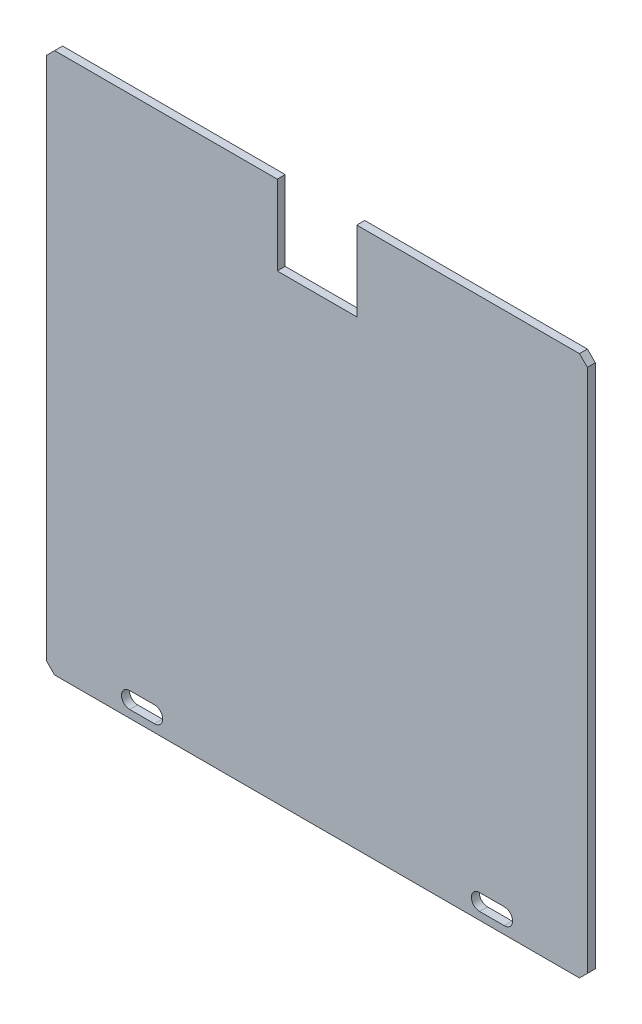
ISO-10303-21;
HEADER;
FILE_DESCRIPTION(('STEP AP214'),'2;1');
FILE_NAME('part.step','',(''),(''),'','','');
FILE_SCHEMA(('AUTOMOTIVE_DESIGN { 1 0 10303 214 1 1 1 1 }'));
ENDSEC;
DATA;
#1=APPLICATION_CONTEXT('core data for automotive mechanical design processes');
#2=APPLICATION_PROTOCOL_DEFINITION('international standard','automotive_design',2000,#1);
#3=PRODUCT_CONTEXT('',#1,'mechanical');
#4=PRODUCT('Part','Part','',(#3));
#5=PRODUCT_RELATED_PRODUCT_CATEGORY('part','',(#4));
#6=PRODUCT_DEFINITION_FORMATION('','',#4);
#7=PRODUCT_DEFINITION_CONTEXT('part definition',#1,'design');
#8=PRODUCT_DEFINITION('design','',#6,#7);
#9=PRODUCT_DEFINITION_SHAPE('','',#8);
#10=(LENGTH_UNIT() NAMED_UNIT(*) SI_UNIT(.MILLI.,.METRE.));
#11=(NAMED_UNIT(*) PLANE_ANGLE_UNIT() SI_UNIT($,.RADIAN.));
#12=(NAMED_UNIT(*) SI_UNIT($,.STERADIAN.) SOLID_ANGLE_UNIT());
#13=UNCERTAINTY_MEASURE_WITH_UNIT(LENGTH_MEASURE(1.E-05),#10,'distance_accuracy_value','');
#14=(GEOMETRIC_REPRESENTATION_CONTEXT(3) GLOBAL_UNCERTAINTY_ASSIGNED_CONTEXT((#13)) GLOBAL_UNIT_ASSIGNED_CONTEXT((#10,
#11,#12)) REPRESENTATION_CONTEXT('',''));
#15=CARTESIAN_POINT('',(0.,0.,0.));
#16=DIRECTION('',(0.,0.,1.));
#17=DIRECTION('',(1.,0.,0.));
#18=AXIS2_PLACEMENT_3D('',#15,#16,#17);
#19=CARTESIAN_POINT('',(-170.,170.,5.));
#20=DIRECTION('',(0.,-1.,0.));
#21=DIRECTION('',(0.,0.,-1.));
#22=AXIS2_PLACEMENT_3D('',#19,#20,#21);
#23=PLANE('',#22);
#24=DIRECTION('',(-1.,0.,0.));
#25=VECTOR('',#24,1.);
#26=CARTESIAN_POINT('',(-170.,170.,0.));
#27=LINE('',#26,#25);
#28=CARTESIAN_POINT('',(165.,170.,0.));
#29=VERTEX_POINT('',#28);
#30=CARTESIAN_POINT('',(25.,170.,0.));
#31=VERTEX_POINT('',#30);
#32=EDGE_CURVE('E188',#29,#31,#27,.T.);
#33=ORIENTED_EDGE('',*,*,#32,.T.);
#34=DIRECTION('',(0.,0.,1.));
#35=VECTOR('',#34,1.);
#36=CARTESIAN_POINT('',(25.,170.,0.));
#37=LINE('',#36,#35);
#38=CARTESIAN_POINT('',(25.,170.,5.));
#39=VERTEX_POINT('',#38);
#40=EDGE_CURVE('E170',#31,#39,#37,.T.);
#41=ORIENTED_EDGE('',*,*,#40,.T.);
#42=DIRECTION('',(-1.,0.,0.));
#43=VECTOR('',#42,1.);
#44=CARTESIAN_POINT('',(-170.,170.,5.));
#45=LINE('',#44,#43);
#46=CARTESIAN_POINT('',(165.,170.,5.));
#47=VERTEX_POINT('',#46);
#48=EDGE_CURVE('E264',#47,#39,#45,.T.);
#49=ORIENTED_EDGE('',*,*,#48,.F.);
#50=DIRECTION('',(0.,0.,-1.));
#51=VECTOR('',#50,1.);
#52=CARTESIAN_POINT('',(165.,170.,5.));
#53=LINE('',#52,#51);
#54=EDGE_CURVE('E194',#47,#29,#53,.T.);
#55=ORIENTED_EDGE('',*,*,#54,.T.);
#56=EDGE_LOOP('',(#33,#41,#49,#55));
#57=FACE_BOUND('',#56,.T.);
#58=ADVANCED_FACE('F32',(#57),#23,.F.);
#59=CARTESIAN_POINT('',(0.,0.,5.));
#60=DIRECTION('',(0.,0.,-1.));
#61=DIRECTION('',(-1.,0.,0.));
#62=AXIS2_PLACEMENT_3D('',#59,#60,#61);
#63=PLANE('',#62);
#64=ORIENTED_EDGE('',*,*,#48,.T.);
#65=DIRECTION('',(0.,1.,0.));
#66=VECTOR('',#65,1.);
#67=CARTESIAN_POINT('',(25.,120.,5.));
#68=LINE('',#67,#66);
#69=CARTESIAN_POINT('',(25.,120.,5.));
#70=VERTEX_POINT('',#69);
#71=EDGE_CURVE('E176',#70,#39,#68,.T.);
#72=ORIENTED_EDGE('',*,*,#71,.F.);
#73=DIRECTION('',(1.,0.,0.));
#74=VECTOR('',#73,1.);
#75=CARTESIAN_POINT('',(-25.,120.,5.));
#76=LINE('',#75,#74);
#77=CARTESIAN_POINT('',(-25.,120.,5.));
#78=VERTEX_POINT('',#77);
#79=EDGE_CURVE('E190',#78,#70,#76,.T.);
#80=ORIENTED_EDGE('',*,*,#79,.F.);
#81=DIRECTION('',(0.,-1.,0.));
#82=VECTOR('',#81,1.);
#83=CARTESIAN_POINT('',(-25.,120.,5.));
#84=LINE('',#83,#82);
#85=CARTESIAN_POINT('',(-25.,170.,5.));
#86=VERTEX_POINT('',#85);
#87=EDGE_CURVE('E337',#86,#78,#84,.T.);
#88=ORIENTED_EDGE('',*,*,#87,.F.);
#89=CARTESIAN_POINT('',(-165.,170.,5.));
#90=VERTEX_POINT('',#89);
#91=EDGE_CURVE('E268',#86,#90,#45,.T.);
#92=ORIENTED_EDGE('',*,*,#91,.T.);
#93=DIRECTION('',(0.707106781186551,0.707106781186544,0.));
#94=VECTOR('',#93,1.);
#95=CARTESIAN_POINT('',(-170.,165.,5.));
#96=LINE('',#95,#94);
#97=CARTESIAN_POINT('',(-170.,165.,5.));
#98=VERTEX_POINT('',#97);
#99=EDGE_CURVE('E227',#90,#98,#96,.F.);
#100=ORIENTED_EDGE('',*,*,#99,.T.);
#101=DIRECTION('',(0.,-1.,0.));
#102=VECTOR('',#101,1.);
#103=CARTESIAN_POINT('',(-170.,-170.,5.));
#104=LINE('',#103,#102);
#105=CARTESIAN_POINT('',(-170.,-165.,5.));
#106=VERTEX_POINT('',#105);
#107=EDGE_CURVE('E247',#98,#106,#104,.T.);
#108=ORIENTED_EDGE('',*,*,#107,.T.);
#109=DIRECTION('',(-0.707106781186544,0.707106781186551,0.));
#110=VECTOR('',#109,1.);
#111=CARTESIAN_POINT('',(-165.,-170.,5.));
#112=LINE('',#111,#110);
#113=CARTESIAN_POINT('',(-165.,-170.,5.));
#114=VERTEX_POINT('',#113);
#115=EDGE_CURVE('E229',#106,#114,#112,.F.);
#116=ORIENTED_EDGE('',*,*,#115,.T.);
#117=DIRECTION('',(1.,0.,0.));
#118=VECTOR('',#117,1.);
#119=CARTESIAN_POINT('',(-170.,-170.,5.));
#120=LINE('',#119,#118);
#121=CARTESIAN_POINT('',(165.,-170.,5.));
#122=VERTEX_POINT('',#121);
#123=EDGE_CURVE('E211',#114,#122,#120,.T.);
#124=ORIENTED_EDGE('',*,*,#123,.T.);
#125=DIRECTION('',(-0.707106781186551,-0.707106781186544,0.));
#126=VECTOR('',#125,1.);
#127=CARTESIAN_POINT('',(170.,-165.,5.));
#128=LINE('',#127,#126);
#129=CARTESIAN_POINT('',(170.,-165.,5.));
#130=VERTEX_POINT('',#129);
#131=EDGE_CURVE('E231',#122,#130,#128,.F.);
#132=ORIENTED_EDGE('',*,*,#131,.T.);
#133=DIRECTION('',(0.,1.,0.));
#134=VECTOR('',#133,1.);
#135=CARTESIAN_POINT('',(170.,-170.,5.));
#136=LINE('',#135,#134);
#137=CARTESIAN_POINT('',(170.,165.,5.));
#138=VERTEX_POINT('',#137);
#139=EDGE_CURVE('E207',#130,#138,#136,.T.);
#140=ORIENTED_EDGE('',*,*,#139,.T.);
#141=DIRECTION('',(0.707106781186544,-0.707106781186551,0.));
#142=VECTOR('',#141,1.);
#143=CARTESIAN_POINT('',(165.,170.,5.));
#144=LINE('',#143,#142);
#145=EDGE_CURVE('E233',#138,#47,#144,.F.);
#146=ORIENTED_EDGE('',*,*,#145,.T.);
#147=EDGE_LOOP('',(#64,#72,#80,#88,#92,#100,#108,#116,#124,#132,#140,#146));
#148=FACE_BOUND('',#147,.T.);
#149=DIRECTION('',(1.,0.,0.));
#150=VECTOR('',#149,1.);
#151=CARTESIAN_POINT('',(-117.8,-165.15,5.));
#152=LINE('',#151,#150);
#153=CARTESIAN_POINT('',(-117.8,-165.15,5.));
#154=VERTEX_POINT('',#153);
#155=CARTESIAN_POINT('',(-102.2,-165.15,5.));
#156=VERTEX_POINT('',#155);
#157=EDGE_CURVE('E288',#154,#156,#152,.T.);
#158=ORIENTED_EDGE('',*,*,#157,.F.);
#159=CARTESIAN_POINT('',(-117.8,-160.,5.));
#160=DIRECTION('',(0.,0.,1.));
#161=DIRECTION('',(1.,0.,0.));
#162=AXIS2_PLACEMENT_3D('',#159,#160,#161);
#163=CIRCLE('',#162,5.15000000000002);
#164=CARTESIAN_POINT('',(-117.8,-154.85,5.));
#165=VERTEX_POINT('',#164);
#166=EDGE_CURVE('E291',#165,#154,#163,.T.);
#167=ORIENTED_EDGE('',*,*,#166,.F.);
#168=DIRECTION('',(-1.,0.,0.));
#169=VECTOR('',#168,1.);
#170=CARTESIAN_POINT('',(-117.8,-154.85,5.));
#171=LINE('',#170,#169);
#172=CARTESIAN_POINT('',(-102.2,-154.85,5.));
#173=VERTEX_POINT('',#172);
#174=EDGE_CURVE('E281',#173,#165,#171,.T.);
#175=ORIENTED_EDGE('',*,*,#174,.F.);
#176=CARTESIAN_POINT('',(-102.2,-160.,5.));
#177=DIRECTION('',(0.,0.,1.));
#178=DIRECTION('',(1.,0.,0.));
#179=AXIS2_PLACEMENT_3D('',#176,#177,#178);
#180=CIRCLE('',#179,5.15000000000002);
#181=EDGE_CURVE('E285',#156,#173,#180,.T.);
#182=ORIENTED_EDGE('',*,*,#181,.F.);
#183=EDGE_LOOP('',(#158,#167,#175,#182));
#184=FACE_BOUND('',#183,.T.);
#185=CARTESIAN_POINT('',(117.8,-160.,5.));
#186=DIRECTION('',(0.,0.,-1.));
#187=DIRECTION('',(-1.,0.,0.));
#188=AXIS2_PLACEMENT_3D('',#185,#186,#187);
#189=CIRCLE('',#188,5.15000000000002);
#190=CARTESIAN_POINT('',(117.8,-154.85,5.));
#191=VERTEX_POINT('',#190);
#192=CARTESIAN_POINT('',(117.8,-165.15,5.));
#193=VERTEX_POINT('',#192);
#194=EDGE_CURVE('E55',#191,#193,#189,.T.);
#195=ORIENTED_EDGE('',*,*,#194,.T.);
#196=DIRECTION('',(-1.,0.,0.));
#197=VECTOR('',#196,1.);
#198=CARTESIAN_POINT('',(117.8,-165.15,5.));
#199=LINE('',#198,#197);
#200=CARTESIAN_POINT('',(102.2,-165.15,5.));
#201=VERTEX_POINT('',#200);
#202=EDGE_CURVE('E312',#193,#201,#199,.T.);
#203=ORIENTED_EDGE('',*,*,#202,.T.);
#204=CARTESIAN_POINT('',(102.2,-160.,5.));
#205=DIRECTION('',(0.,0.,-1.));
#206=DIRECTION('',(-1.,0.,0.));
#207=AXIS2_PLACEMENT_3D('',#204,#205,#206);
#208=CIRCLE('',#207,5.15000000000002);
#209=CARTESIAN_POINT('',(102.2,-154.85,5.));
#210=VERTEX_POINT('',#209);
#211=EDGE_CURVE('E316',#201,#210,#208,.T.);
#212=ORIENTED_EDGE('',*,*,#211,.T.);
#213=DIRECTION('',(1.,0.,0.));
#214=VECTOR('',#213,1.);
#215=CARTESIAN_POINT('',(117.8,-154.85,5.));
#216=LINE('',#215,#214);
#217=EDGE_CURVE('E319',#210,#191,#216,.T.);
#218=ORIENTED_EDGE('',*,*,#217,.T.);
#219=EDGE_LOOP('',(#195,#203,#212,#218));
#220=FACE_BOUND('',#219,.T.);
#221=ADVANCED_FACE('F348',(#148,#184,#220),#63,.F.);
#222=CARTESIAN_POINT('',(0.,0.,0.));
#223=DIRECTION('',(0.,0.,-1.));
#224=DIRECTION('',(-1.,0.,0.));
#225=AXIS2_PLACEMENT_3D('',#222,#223,#224);
#226=PLANE('',#225);
#227=DIRECTION('',(0.,1.,0.));
#228=VECTOR('',#227,1.);
#229=CARTESIAN_POINT('',(25.,120.,0.));
#230=LINE('',#229,#228);
#231=CARTESIAN_POINT('',(25.,120.,0.));
#232=VERTEX_POINT('',#231);
#233=EDGE_CURVE('E173',#232,#31,#230,.T.);
#234=ORIENTED_EDGE('',*,*,#233,.T.);
#235=ORIENTED_EDGE('',*,*,#32,.F.);
#236=DIRECTION('',(-0.707106781186544,0.707106781186551,0.));
#237=VECTOR('',#236,1.);
#238=CARTESIAN_POINT('',(167.500000000001,167.499999999999,0.));
#239=LINE('',#238,#237);
#240=CARTESIAN_POINT('',(170.,165.,0.));
#241=VERTEX_POINT('',#240);
#242=EDGE_CURVE('E220',#29,#241,#239,.F.);
#243=ORIENTED_EDGE('',*,*,#242,.T.);
#244=DIRECTION('',(0.,1.,0.));
#245=VECTOR('',#244,1.);
#246=CARTESIAN_POINT('',(170.,-170.,0.));
#247=LINE('',#246,#245);
#248=CARTESIAN_POINT('',(170.,-165.,0.));
#249=VERTEX_POINT('',#248);
#250=EDGE_CURVE('E201',#249,#241,#247,.T.);
#251=ORIENTED_EDGE('',*,*,#250,.F.);
#252=DIRECTION('',(0.707106781186551,0.707106781186544,0.));
#253=VECTOR('',#252,1.);
#254=CARTESIAN_POINT('',(167.499999999999,-167.500000000001,0.));
#255=LINE('',#254,#253);
#256=CARTESIAN_POINT('',(165.,-170.,0.));
#257=VERTEX_POINT('',#256);
#258=EDGE_CURVE('E218',#249,#257,#255,.F.);
#259=ORIENTED_EDGE('',*,*,#258,.T.);
#260=DIRECTION('',(1.,0.,0.));
#261=VECTOR('',#260,1.);
#262=CARTESIAN_POINT('',(-170.,-170.,0.));
#263=LINE('',#262,#261);
#264=CARTESIAN_POINT('',(-165.,-170.,0.));
#265=VERTEX_POINT('',#264);
#266=EDGE_CURVE('E199',#265,#257,#263,.T.);
#267=ORIENTED_EDGE('',*,*,#266,.F.);
#268=DIRECTION('',(0.707106781186544,-0.707106781186551,0.));
#269=VECTOR('',#268,1.);
#270=CARTESIAN_POINT('',(-167.500000000001,-167.499999999999,0.));
#271=LINE('',#270,#269);
#272=CARTESIAN_POINT('',(-170.,-165.,0.));
#273=VERTEX_POINT('',#272);
#274=EDGE_CURVE('E216',#265,#273,#271,.F.);
#275=ORIENTED_EDGE('',*,*,#274,.T.);
#276=DIRECTION('',(0.,-1.,0.));
#277=VECTOR('',#276,1.);
#278=CARTESIAN_POINT('',(-170.,-170.,0.));
#279=LINE('',#278,#277);
#280=CARTESIAN_POINT('',(-170.,165.,0.));
#281=VERTEX_POINT('',#280);
#282=EDGE_CURVE('E195',#281,#273,#279,.T.);
#283=ORIENTED_EDGE('',*,*,#282,.F.);
#284=DIRECTION('',(-0.707106781186551,-0.707106781186544,0.));
#285=VECTOR('',#284,1.);
#286=CARTESIAN_POINT('',(-167.499999999999,167.500000000001,0.));
#287=LINE('',#286,#285);
#288=CARTESIAN_POINT('',(-165.,170.,0.));
#289=VERTEX_POINT('',#288);
#290=EDGE_CURVE('E213',#281,#289,#287,.F.);
#291=ORIENTED_EDGE('',*,*,#290,.T.);
#292=CARTESIAN_POINT('',(-25.,170.,0.));
#293=VERTEX_POINT('',#292);
#294=EDGE_CURVE('E196',#293,#289,#27,.T.);
#295=ORIENTED_EDGE('',*,*,#294,.F.);
#296=DIRECTION('',(0.,-1.,0.));
#297=VECTOR('',#296,1.);
#298=CARTESIAN_POINT('',(-25.,120.,0.));
#299=LINE('',#298,#297);
#300=CARTESIAN_POINT('',(-25.,120.,0.));
#301=VERTEX_POINT('',#300);
#302=EDGE_CURVE('E47',#293,#301,#299,.T.);
#303=ORIENTED_EDGE('',*,*,#302,.T.);
#304=DIRECTION('',(1.,0.,0.));
#305=VECTOR('',#304,1.);
#306=CARTESIAN_POINT('',(-25.,120.,0.));
#307=LINE('',#306,#305);
#308=EDGE_CURVE('E182',#301,#232,#307,.T.);
#309=ORIENTED_EDGE('',*,*,#308,.T.);
#310=EDGE_LOOP('',(#234,#235,#243,#251,#259,#267,#275,#283,#291,#295,#303,#309));
#311=FACE_BOUND('',#310,.T.);
#312=CARTESIAN_POINT('',(-117.8,-160.,0.));
#313=DIRECTION('',(0.,0.,1.));
#314=DIRECTION('',(1.,0.,0.));
#315=AXIS2_PLACEMENT_3D('',#312,#313,#314);
#316=CIRCLE('',#315,5.15000000000002);
#317=CARTESIAN_POINT('',(-117.8,-154.85,0.));
#318=VERTEX_POINT('',#317);
#319=CARTESIAN_POINT('',(-117.8,-165.15,0.));
#320=VERTEX_POINT('',#319);
#321=EDGE_CURVE('E284',#318,#320,#316,.T.);
#322=ORIENTED_EDGE('',*,*,#321,.T.);
#323=DIRECTION('',(1.,0.,0.));
#324=VECTOR('',#323,1.);
#325=CARTESIAN_POINT('',(-117.8,-165.15,0.));
#326=LINE('',#325,#324);
#327=CARTESIAN_POINT('',(-102.2,-165.15,0.));
#328=VERTEX_POINT('',#327);
#329=EDGE_CURVE('E299',#320,#328,#326,.T.);
#330=ORIENTED_EDGE('',*,*,#329,.T.);
#331=CARTESIAN_POINT('',(-102.2,-160.,0.));
#332=DIRECTION('',(0.,0.,1.));
#333=DIRECTION('',(1.,0.,0.));
#334=AXIS2_PLACEMENT_3D('',#331,#332,#333);
#335=CIRCLE('',#334,5.15000000000002);
#336=CARTESIAN_POINT('',(-102.2,-154.85,0.));
#337=VERTEX_POINT('',#336);
#338=EDGE_CURVE('E296',#328,#337,#335,.T.);
#339=ORIENTED_EDGE('',*,*,#338,.T.);
#340=DIRECTION('',(-1.,0.,0.));
#341=VECTOR('',#340,1.);
#342=CARTESIAN_POINT('',(-117.8,-154.85,0.));
#343=LINE('',#342,#341);
#344=EDGE_CURVE('E275',#337,#318,#343,.T.);
#345=ORIENTED_EDGE('',*,*,#344,.T.);
#346=EDGE_LOOP('',(#322,#330,#339,#345));
#347=FACE_BOUND('',#346,.T.);
#348=DIRECTION('',(-1.,0.,0.));
#349=VECTOR('',#348,1.);
#350=CARTESIAN_POINT('',(117.8,-165.15,0.));
#351=LINE('',#350,#349);
#352=CARTESIAN_POINT('',(117.8,-165.15,0.));
#353=VERTEX_POINT('',#352);
#354=CARTESIAN_POINT('',(102.2,-165.15,0.));
#355=VERTEX_POINT('',#354);
#356=EDGE_CURVE('E307',#353,#355,#351,.T.);
#357=ORIENTED_EDGE('',*,*,#356,.F.);
#358=CARTESIAN_POINT('',(117.8,-160.,0.));
#359=DIRECTION('',(0.,0.,-1.));
#360=DIRECTION('',(-1.,0.,0.));
#361=AXIS2_PLACEMENT_3D('',#358,#359,#360);
#362=CIRCLE('',#361,5.15000000000002);
#363=CARTESIAN_POINT('',(117.8,-154.85,0.));
#364=VERTEX_POINT('',#363);
#365=EDGE_CURVE('E315',#364,#353,#362,.T.);
#366=ORIENTED_EDGE('',*,*,#365,.F.);
#367=DIRECTION('',(1.,0.,0.));
#368=VECTOR('',#367,1.);
#369=CARTESIAN_POINT('',(117.8,-154.85,0.));
#370=LINE('',#369,#368);
#371=CARTESIAN_POINT('',(102.2,-154.85,0.));
#372=VERTEX_POINT('',#371);
#373=EDGE_CURVE('E328',#372,#364,#370,.T.);
#374=ORIENTED_EDGE('',*,*,#373,.F.);
#375=CARTESIAN_POINT('',(102.2,-160.,0.));
#376=DIRECTION('',(0.,0.,-1.));
#377=DIRECTION('',(-1.,0.,0.));
#378=AXIS2_PLACEMENT_3D('',#375,#376,#377);
#379=CIRCLE('',#378,5.15000000000002);
#380=EDGE_CURVE('E325',#355,#372,#379,.T.);
#381=ORIENTED_EDGE('',*,*,#380,.F.);
#382=EDGE_LOOP('',(#357,#366,#374,#381));
#383=FACE_BOUND('',#382,.T.);
#384=ADVANCED_FACE('F186',(#311,#347,#383),#226,.T.);
#385=CARTESIAN_POINT('',(170.,-170.,5.));
#386=DIRECTION('',(-1.,0.,0.));
#387=DIRECTION('',(0.,0.,1.));
#388=AXIS2_PLACEMENT_3D('',#385,#386,#387);
#389=PLANE('',#388);
#390=ORIENTED_EDGE('',*,*,#250,.T.);
#391=DIRECTION('',(0.,0.,1.));
#392=VECTOR('',#391,1.);
#393=CARTESIAN_POINT('',(170.,165.,5.));
#394=LINE('',#393,#392);
#395=EDGE_CURVE('E225',#241,#138,#394,.T.);
#396=ORIENTED_EDGE('',*,*,#395,.T.);
#397=ORIENTED_EDGE('',*,*,#139,.F.);
#398=DIRECTION('',(0.,0.,-1.));
#399=VECTOR('',#398,1.);
#400=CARTESIAN_POINT('',(170.,-165.,5.));
#401=LINE('',#400,#399);
#402=EDGE_CURVE('E222',#130,#249,#401,.T.);
#403=ORIENTED_EDGE('',*,*,#402,.T.);
#404=EDGE_LOOP('',(#390,#396,#397,#403));
#405=FACE_BOUND('',#404,.T.);
#406=ADVANCED_FACE('F370',(#405),#389,.F.);
#407=ORIENTED_EDGE('',*,*,#91,.F.);
#408=DIRECTION('',(0.,0.,1.));
#409=VECTOR('',#408,1.);
#410=CARTESIAN_POINT('',(-25.,170.,0.));
#411=LINE('',#410,#409);
#412=EDGE_CURVE('E181',#293,#86,#411,.T.);
#413=ORIENTED_EDGE('',*,*,#412,.F.);
#414=ORIENTED_EDGE('',*,*,#294,.T.);
#415=DIRECTION('',(0.,0.,1.));
#416=VECTOR('',#415,1.);
#417=CARTESIAN_POINT('',(-165.,170.,5.));
#418=LINE('',#417,#416);
#419=EDGE_CURVE('E208',#289,#90,#418,.T.);
#420=ORIENTED_EDGE('',*,*,#419,.T.);
#421=EDGE_LOOP('',(#407,#413,#414,#420));
#422=FACE_BOUND('',#421,.T.);
#423=ADVANCED_FACE('F344',(#422),#23,.F.);
#424=CARTESIAN_POINT('',(-170.,-170.,5.));
#425=DIRECTION('',(1.,0.,0.));
#426=DIRECTION('',(0.,0.,-1.));
#427=AXIS2_PLACEMENT_3D('',#424,#425,#426);
#428=PLANE('',#427);
#429=ORIENTED_EDGE('',*,*,#282,.T.);
#430=DIRECTION('',(0.,0.,1.));
#431=VECTOR('',#430,1.);
#432=CARTESIAN_POINT('',(-170.,-165.,5.));
#433=LINE('',#432,#431);
#434=EDGE_CURVE('E11',#273,#106,#433,.T.);
#435=ORIENTED_EDGE('',*,*,#434,.T.);
#436=ORIENTED_EDGE('',*,*,#107,.F.);
#437=DIRECTION('',(0.,0.,-1.));
#438=VECTOR('',#437,1.);
#439=CARTESIAN_POINT('',(-170.,165.,5.));
#440=LINE('',#439,#438);
#441=EDGE_CURVE('E40',#98,#281,#440,.T.);
#442=ORIENTED_EDGE('',*,*,#441,.T.);
#443=EDGE_LOOP('',(#429,#435,#436,#442));
#444=FACE_BOUND('',#443,.T.);
#445=ADVANCED_FACE('F244',(#444),#428,.F.);
#446=CARTESIAN_POINT('',(-170.,-170.,5.));
#447=DIRECTION('',(0.,1.,0.));
#448=DIRECTION('',(0.,0.,1.));
#449=AXIS2_PLACEMENT_3D('',#446,#447,#448);
#450=PLANE('',#449);
#451=ORIENTED_EDGE('',*,*,#266,.T.);
#452=DIRECTION('',(0.,0.,1.));
#453=VECTOR('',#452,1.);
#454=CARTESIAN_POINT('',(165.,-170.,5.));
#455=LINE('',#454,#453);
#456=EDGE_CURVE('E238',#257,#122,#455,.T.);
#457=ORIENTED_EDGE('',*,*,#456,.T.);
#458=ORIENTED_EDGE('',*,*,#123,.F.);
#459=DIRECTION('',(0.,0.,-1.));
#460=VECTOR('',#459,1.);
#461=CARTESIAN_POINT('',(-165.,-170.,5.));
#462=LINE('',#461,#460);
#463=EDGE_CURVE('E235',#114,#265,#462,.T.);
#464=ORIENTED_EDGE('',*,*,#463,.T.);
#465=EDGE_LOOP('',(#451,#457,#458,#464));
#466=FACE_BOUND('',#465,.T.);
#467=ADVANCED_FACE('F259',(#466),#450,.F.);
#468=CARTESIAN_POINT('',(165.,170.,5.));
#469=DIRECTION('',(-0.707106781186551,-0.707106781186544,0.));
#470=DIRECTION('',(0.,0.,-1.));
#471=AXIS2_PLACEMENT_3D('',#468,#469,#470);
#472=PLANE('',#471);
#473=ORIENTED_EDGE('',*,*,#145,.F.);
#474=ORIENTED_EDGE('',*,*,#395,.F.);
#475=ORIENTED_EDGE('',*,*,#242,.F.);
#476=ORIENTED_EDGE('',*,*,#54,.F.);
#477=EDGE_LOOP('',(#473,#474,#475,#476));
#478=FACE_BOUND('',#477,.T.);
#479=ADVANCED_FACE('F382',(#478),#472,.F.);
#480=CARTESIAN_POINT('',(170.,-165.,5.));
#481=DIRECTION('',(-0.707106781186543,0.707106781186551,0.));
#482=DIRECTION('',(0.,0.,-1.));
#483=AXIS2_PLACEMENT_3D('',#480,#481,#482);
#484=PLANE('',#483);
#485=ORIENTED_EDGE('',*,*,#131,.F.);
#486=ORIENTED_EDGE('',*,*,#456,.F.);
#487=ORIENTED_EDGE('',*,*,#258,.F.);
#488=ORIENTED_EDGE('',*,*,#402,.F.);
#489=EDGE_LOOP('',(#485,#486,#487,#488));
#490=FACE_BOUND('',#489,.T.);
#491=ADVANCED_FACE('F385',(#490),#484,.F.);
#492=CARTESIAN_POINT('',(-165.,-170.,5.));
#493=DIRECTION('',(0.707106781186551,0.707106781186543,0.));
#494=DIRECTION('',(0.,0.,-1.));
#495=AXIS2_PLACEMENT_3D('',#492,#493,#494);
#496=PLANE('',#495);
#497=ORIENTED_EDGE('',*,*,#115,.F.);
#498=ORIENTED_EDGE('',*,*,#434,.F.);
#499=ORIENTED_EDGE('',*,*,#274,.F.);
#500=ORIENTED_EDGE('',*,*,#463,.F.);
#501=EDGE_LOOP('',(#497,#498,#499,#500));
#502=FACE_BOUND('',#501,.T.);
#503=ADVANCED_FACE('F256',(#502),#496,.F.);
#504=CARTESIAN_POINT('',(-170.,165.,5.));
#505=DIRECTION('',(0.707106781186544,-0.707106781186551,0.));
#506=DIRECTION('',(0.,0.,-1.));
#507=AXIS2_PLACEMENT_3D('',#504,#505,#506);
#508=PLANE('',#507);
#509=ORIENTED_EDGE('',*,*,#99,.F.);
#510=ORIENTED_EDGE('',*,*,#419,.F.);
#511=ORIENTED_EDGE('',*,*,#290,.F.);
#512=ORIENTED_EDGE('',*,*,#441,.F.);
#513=EDGE_LOOP('',(#509,#510,#511,#512));
#514=FACE_BOUND('',#513,.T.);
#515=ADVANCED_FACE('F34',(#514),#508,.F.);
#516=CARTESIAN_POINT('',(-117.8,-160.,0.));
#517=DIRECTION('',(0.,0.,1.));
#518=DIRECTION('',(1.,0.,0.));
#519=AXIS2_PLACEMENT_3D('',#516,#517,#518);
#520=CYLINDRICAL_SURFACE('',#519,5.15000000000002);
#521=ORIENTED_EDGE('',*,*,#166,.T.);
#522=DIRECTION('',(0.,0.,1.));
#523=VECTOR('',#522,1.);
#524=CARTESIAN_POINT('',(-117.8,-165.15,0.));
#525=LINE('',#524,#523);
#526=EDGE_CURVE('E271',#320,#154,#525,.T.);
#527=ORIENTED_EDGE('',*,*,#526,.F.);
#528=ORIENTED_EDGE('',*,*,#321,.F.);
#529=DIRECTION('',(0.,0.,1.));
#530=VECTOR('',#529,1.);
#531=CARTESIAN_POINT('',(-117.8,-154.85,0.));
#532=LINE('',#531,#530);
#533=EDGE_CURVE('E279',#318,#165,#532,.T.);
#534=ORIENTED_EDGE('',*,*,#533,.T.);
#535=EDGE_LOOP('',(#521,#527,#528,#534));
#536=FACE_BOUND('',#535,.T.);
#537=ADVANCED_FACE('F393',(#536),#520,.F.);
#538=CARTESIAN_POINT('',(-117.8,-154.85,0.));
#539=DIRECTION('',(0.,1.,0.));
#540=DIRECTION('',(0.,0.,1.));
#541=AXIS2_PLACEMENT_3D('',#538,#539,#540);
#542=PLANE('',#541);
#543=ORIENTED_EDGE('',*,*,#174,.T.);
#544=ORIENTED_EDGE('',*,*,#533,.F.);
#545=ORIENTED_EDGE('',*,*,#344,.F.);
#546=DIRECTION('',(0.,0.,1.));
#547=VECTOR('',#546,1.);
#548=CARTESIAN_POINT('',(-102.2,-154.85,0.));
#549=LINE('',#548,#547);
#550=EDGE_CURVE('E277',#337,#173,#549,.T.);
#551=ORIENTED_EDGE('',*,*,#550,.T.);
#552=EDGE_LOOP('',(#543,#544,#545,#551));
#553=FACE_BOUND('',#552,.T.);
#554=ADVANCED_FACE('F397',(#553),#542,.F.);
#555=CARTESIAN_POINT('',(-102.2,-160.,0.));
#556=DIRECTION('',(0.,0.,1.));
#557=DIRECTION('',(1.,0.,0.));
#558=AXIS2_PLACEMENT_3D('',#555,#556,#557);
#559=CYLINDRICAL_SURFACE('',#558,5.15000000000002);
#560=ORIENTED_EDGE('',*,*,#181,.T.);
#561=ORIENTED_EDGE('',*,*,#550,.F.);
#562=ORIENTED_EDGE('',*,*,#338,.F.);
#563=DIRECTION('',(0.,0.,1.));
#564=VECTOR('',#563,1.);
#565=CARTESIAN_POINT('',(-102.2,-165.15,0.));
#566=LINE('',#565,#564);
#567=EDGE_CURVE('E274',#328,#156,#566,.T.);
#568=ORIENTED_EDGE('',*,*,#567,.T.);
#569=EDGE_LOOP('',(#560,#561,#562,#568));
#570=FACE_BOUND('',#569,.T.);
#571=ADVANCED_FACE('F403',(#570),#559,.F.);
#572=CARTESIAN_POINT('',(-117.8,-165.15,0.));
#573=DIRECTION('',(0.,-1.,0.));
#574=DIRECTION('',(0.,0.,-1.));
#575=AXIS2_PLACEMENT_3D('',#572,#573,#574);
#576=PLANE('',#575);
#577=ORIENTED_EDGE('',*,*,#157,.T.);
#578=ORIENTED_EDGE('',*,*,#567,.F.);
#579=ORIENTED_EDGE('',*,*,#329,.F.);
#580=ORIENTED_EDGE('',*,*,#526,.T.);
#581=EDGE_LOOP('',(#577,#578,#579,#580));
#582=FACE_BOUND('',#581,.T.);
#583=ADVANCED_FACE('F407',(#582),#576,.F.);
#584=CARTESIAN_POINT('',(117.8,-160.,0.));
#585=DIRECTION('',(0.,0.,1.));
#586=DIRECTION('',(1.,0.,0.));
#587=AXIS2_PLACEMENT_3D('',#584,#585,#586);
#588=CYLINDRICAL_SURFACE('',#587,5.15000000000002);
#589=ORIENTED_EDGE('',*,*,#194,.F.);
#590=DIRECTION('',(0.,0.,1.));
#591=VECTOR('',#590,1.);
#592=CARTESIAN_POINT('',(117.8,-154.85,0.));
#593=LINE('',#592,#591);
#594=EDGE_CURVE('E304',#364,#191,#593,.T.);
#595=ORIENTED_EDGE('',*,*,#594,.F.);
#596=ORIENTED_EDGE('',*,*,#365,.T.);
#597=DIRECTION('',(0.,0.,1.));
#598=VECTOR('',#597,1.);
#599=CARTESIAN_POINT('',(117.8,-165.15,0.));
#600=LINE('',#599,#598);
#601=EDGE_CURVE('E293',#353,#193,#600,.T.);
#602=ORIENTED_EDGE('',*,*,#601,.T.);
#603=EDGE_LOOP('',(#589,#595,#596,#602));
#604=FACE_BOUND('',#603,.T.);
#605=ADVANCED_FACE('F458',(#604),#588,.F.);
#606=CARTESIAN_POINT('',(117.8,-165.15,0.));
#607=DIRECTION('',(0.,1.,0.));
#608=DIRECTION('',(0.,0.,1.));
#609=AXIS2_PLACEMENT_3D('',#606,#607,#608);
#610=PLANE('',#609);
#611=ORIENTED_EDGE('',*,*,#202,.F.);
#612=ORIENTED_EDGE('',*,*,#601,.F.);
#613=ORIENTED_EDGE('',*,*,#356,.T.);
#614=DIRECTION('',(0.,0.,1.));
#615=VECTOR('',#614,1.);
#616=CARTESIAN_POINT('',(102.2,-165.15,0.));
#617=LINE('',#616,#615);
#618=EDGE_CURVE('E309',#355,#201,#617,.T.);
#619=ORIENTED_EDGE('',*,*,#618,.T.);
#620=EDGE_LOOP('',(#611,#612,#613,#619));
#621=FACE_BOUND('',#620,.T.);
#622=ADVANCED_FACE('F468',(#621),#610,.T.);
#623=CARTESIAN_POINT('',(102.2,-160.,0.));
#624=DIRECTION('',(0.,0.,1.));
#625=DIRECTION('',(1.,0.,0.));
#626=AXIS2_PLACEMENT_3D('',#623,#624,#625);
#627=CYLINDRICAL_SURFACE('',#626,5.15000000000002);
#628=ORIENTED_EDGE('',*,*,#211,.F.);
#629=ORIENTED_EDGE('',*,*,#618,.F.);
#630=ORIENTED_EDGE('',*,*,#380,.T.);
#631=DIRECTION('',(0.,0.,1.));
#632=VECTOR('',#631,1.);
#633=CARTESIAN_POINT('',(102.2,-154.85,0.));
#634=LINE('',#633,#632);
#635=EDGE_CURVE('E306',#372,#210,#634,.T.);
#636=ORIENTED_EDGE('',*,*,#635,.T.);
#637=EDGE_LOOP('',(#628,#629,#630,#636));
#638=FACE_BOUND('',#637,.T.);
#639=ADVANCED_FACE('F478',(#638),#627,.F.);
#640=CARTESIAN_POINT('',(117.8,-154.85,0.));
#641=DIRECTION('',(0.,-1.,0.));
#642=DIRECTION('',(0.,0.,-1.));
#643=AXIS2_PLACEMENT_3D('',#640,#641,#642);
#644=PLANE('',#643);
#645=ORIENTED_EDGE('',*,*,#217,.F.);
#646=ORIENTED_EDGE('',*,*,#635,.F.);
#647=ORIENTED_EDGE('',*,*,#373,.T.);
#648=ORIENTED_EDGE('',*,*,#594,.T.);
#649=EDGE_LOOP('',(#645,#646,#647,#648));
#650=FACE_BOUND('',#649,.T.);
#651=ADVANCED_FACE('F359',(#650),#644,.T.);
#652=CARTESIAN_POINT('',(25.,120.,0.));
#653=DIRECTION('',(1.,0.,0.));
#654=DIRECTION('',(0.,0.,-1.));
#655=AXIS2_PLACEMENT_3D('',#652,#653,#654);
#656=PLANE('',#655);
#657=ORIENTED_EDGE('',*,*,#71,.T.);
#658=ORIENTED_EDGE('',*,*,#40,.F.);
#659=ORIENTED_EDGE('',*,*,#233,.F.);
#660=DIRECTION('',(0.,0.,1.));
#661=VECTOR('',#660,1.);
#662=CARTESIAN_POINT('',(25.,120.,0.));
#663=LINE('',#662,#661);
#664=EDGE_CURVE('E323',#232,#70,#663,.T.);
#665=ORIENTED_EDGE('',*,*,#664,.T.);
#666=EDGE_LOOP('',(#657,#658,#659,#665));
#667=FACE_BOUND('',#666,.T.);
#668=ADVANCED_FACE('F172',(#667),#656,.F.);
#669=CARTESIAN_POINT('',(-25.,120.,0.));
#670=DIRECTION('',(0.,-1.,0.));
#671=DIRECTION('',(0.,0.,-1.));
#672=AXIS2_PLACEMENT_3D('',#669,#670,#671);
#673=PLANE('',#672);
#674=ORIENTED_EDGE('',*,*,#79,.T.);
#675=ORIENTED_EDGE('',*,*,#664,.F.);
#676=ORIENTED_EDGE('',*,*,#308,.F.);
#677=DIRECTION('',(0.,0.,1.));
#678=VECTOR('',#677,1.);
#679=CARTESIAN_POINT('',(-25.,120.,0.));
#680=LINE('',#679,#678);
#681=EDGE_CURVE('E332',#301,#78,#680,.T.);
#682=ORIENTED_EDGE('',*,*,#681,.T.);
#683=EDGE_LOOP('',(#674,#675,#676,#682));
#684=FACE_BOUND('',#683,.T.);
#685=ADVANCED_FACE('F351',(#684),#673,.F.);
#686=CARTESIAN_POINT('',(-25.,120.,0.));
#687=DIRECTION('',(-1.,0.,0.));
#688=DIRECTION('',(0.,0.,1.));
#689=AXIS2_PLACEMENT_3D('',#686,#687,#688);
#690=PLANE('',#689);
#691=ORIENTED_EDGE('',*,*,#87,.T.);
#692=ORIENTED_EDGE('',*,*,#681,.F.);
#693=ORIENTED_EDGE('',*,*,#302,.F.);
#694=ORIENTED_EDGE('',*,*,#412,.T.);
#695=EDGE_LOOP('',(#691,#692,#693,#694));
#696=FACE_BOUND('',#695,.T.);
#697=ADVANCED_FACE('F346',(#696),#690,.F.);
#698=CLOSED_SHELL('',(#58,#221,#384,#406,#423,#445,#467,#479,#491,#503,#515,#537,#554,#571,#583,
#605,#622,#639,#651,#668,#685,#697));
#699=MANIFOLD_SOLID_BREP('B2',#698);
#700=ADVANCED_BREP_SHAPE_REPRESENTATION('',(#18,#699),#14);
#701=SHAPE_DEFINITION_REPRESENTATION(#9,#700);
ENDSEC;
END-ISO-10303-21;
